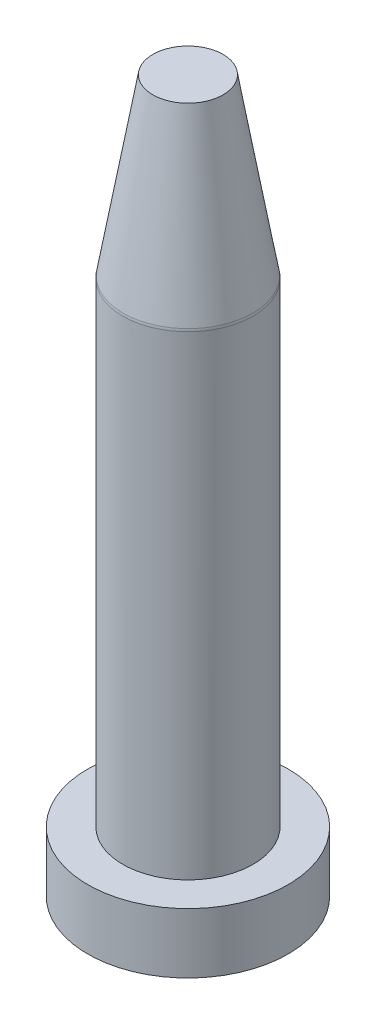
ISO-10303-21;
HEADER;
FILE_DESCRIPTION(('STEP AP214'),'2;1');
FILE_NAME('part.step','',(''),(''),'','','');
FILE_SCHEMA(('AUTOMOTIVE_DESIGN { 1 0 10303 214 1 1 1 1 }'));
ENDSEC;
DATA;
#1=APPLICATION_CONTEXT('core data for automotive mechanical design processes');
#2=APPLICATION_PROTOCOL_DEFINITION('international standard','automotive_design',2000,#1);
#3=PRODUCT_CONTEXT('',#1,'mechanical');
#4=PRODUCT('Part','Part','',(#3));
#5=PRODUCT_RELATED_PRODUCT_CATEGORY('part','',(#4));
#6=PRODUCT_DEFINITION_FORMATION('','',#4);
#7=PRODUCT_DEFINITION_CONTEXT('part definition',#1,'design');
#8=PRODUCT_DEFINITION('design','',#6,#7);
#9=PRODUCT_DEFINITION_SHAPE('','',#8);
#10=(LENGTH_UNIT() NAMED_UNIT(*) SI_UNIT(.MILLI.,.METRE.));
#11=(NAMED_UNIT(*) PLANE_ANGLE_UNIT() SI_UNIT($,.RADIAN.));
#12=(NAMED_UNIT(*) SI_UNIT($,.STERADIAN.) SOLID_ANGLE_UNIT());
#13=UNCERTAINTY_MEASURE_WITH_UNIT(LENGTH_MEASURE(1.E-05),#10,'distance_accuracy_value','');
#14=(GEOMETRIC_REPRESENTATION_CONTEXT(3) GLOBAL_UNCERTAINTY_ASSIGNED_CONTEXT((#13)) GLOBAL_UNIT_ASSIGNED_CONTEXT((#10,
#11,#12)) REPRESENTATION_CONTEXT('',''));
#15=CARTESIAN_POINT('',(0.,0.,0.));
#16=DIRECTION('',(0.,0.,1.));
#17=DIRECTION('',(1.,0.,0.));
#18=AXIS2_PLACEMENT_3D('',#15,#16,#17);
#19=CARTESIAN_POINT('',(0.,142.,0.));
#20=DIRECTION('',(0.,1.,0.));
#21=DIRECTION('',(0.,0.,1.));
#22=AXIS2_PLACEMENT_3D('',#19,#20,#21);
#23=PLANE('',#22);
#24=CARTESIAN_POINT('',(0.,142.,0.));
#25=DIRECTION('',(0.,-1.,0.));
#26=DIRECTION('',(0.,0.,-1.));
#27=AXIS2_PLACEMENT_3D('',#24,#25,#26);
#28=CIRCLE('',#27,7.);
#29=CARTESIAN_POINT('',(0.,142.,-7.));
#30=VERTEX_POINT('',#29);
#31=EDGE_CURVE('E44',#30,#30,#28,.T.);
#32=ORIENTED_EDGE('',*,*,#31,.F.);
#33=EDGE_LOOP('',(#32));
#34=FACE_BOUND('',#33,.T.);
#35=ADVANCED_FACE('F33',(#34),#23,.T.);
#36=CARTESIAN_POINT('',(0.,107.,0.));
#37=DIRECTION('',(0.,-1.,0.));
#38=DIRECTION('',(0.,0.,-1.));
#39=AXIS2_PLACEMENT_3D('',#36,#37,#38);
#40=CONICAL_SURFACE('',#39,13.,0.169778273968338);
#41=CARTESIAN_POINT('',(0.,107.251610540768,0.));
#42=DIRECTION('',(0.,1.,0.));
#43=DIRECTION('',(0.,0.,1.));
#44=AXIS2_PLACEMENT_3D('',#41,#42,#43);
#45=CIRCLE('',#44,12.9568667644398);
#46=CARTESIAN_POINT('',(0.,107.251610540768,12.9568667644398));
#47=VERTEX_POINT('',#46);
#48=EDGE_CURVE('E10',#47,#47,#45,.T.);
#49=ORIENTED_EDGE('',*,*,#48,.T.);
#50=EDGE_LOOP('',(#49));
#51=FACE_BOUND('',#50,.T.);
#52=ORIENTED_EDGE('',*,*,#31,.T.);
#53=EDGE_LOOP('',(#52));
#54=FACE_BOUND('',#53,.T.);
#55=ADVANCED_FACE('F76',(#51,#54),#40,.T.);
#56=CARTESIAN_POINT('',(0.,0.,0.));
#57=DIRECTION('',(0.,-1.,0.));
#58=DIRECTION('',(0.,0.,-1.));
#59=AXIS2_PLACEMENT_3D('',#56,#57,#58);
#60=CYLINDRICAL_SURFACE('',#59,13.);
#61=CARTESIAN_POINT('',(0.,106.744719095435,0.));
#62=DIRECTION('',(0.,1.,0.));
#63=DIRECTION('',(0.,0.,1.));
#64=AXIS2_PLACEMENT_3D('',#61,#62,#63);
#65=CIRCLE('',#64,13.);
#66=CARTESIAN_POINT('',(0.,106.744719095435,13.));
#67=VERTEX_POINT('',#66);
#68=EDGE_CURVE('E40',#67,#67,#65,.F.);
#69=ORIENTED_EDGE('',*,*,#68,.T.);
#70=EDGE_LOOP('',(#69));
#71=FACE_BOUND('',#70,.T.);
#72=CARTESIAN_POINT('',(0.,12.,0.));
#73=DIRECTION('',(0.,-1.,0.));
#74=DIRECTION('',(0.,0.,-1.));
#75=AXIS2_PLACEMENT_3D('',#72,#73,#74);
#76=CIRCLE('',#75,13.);
#77=CARTESIAN_POINT('',(0.,12.,-13.));
#78=VERTEX_POINT('',#77);
#79=EDGE_CURVE('E48',#78,#78,#76,.T.);
#80=ORIENTED_EDGE('',*,*,#79,.F.);
#81=EDGE_LOOP('',(#80));
#82=FACE_BOUND('',#81,.T.);
#83=ADVANCED_FACE('F72',(#71,#82),#60,.T.);
#84=CARTESIAN_POINT('',(20.,12.,0.));
#85=DIRECTION('',(0.,1.,0.));
#86=DIRECTION('',(0.,0.,1.));
#87=AXIS2_PLACEMENT_3D('',#84,#85,#86);
#88=PLANE('',#87);
#89=ORIENTED_EDGE('',*,*,#79,.T.);
#90=EDGE_LOOP('',(#89));
#91=FACE_BOUND('',#90,.T.);
#92=CARTESIAN_POINT('',(0.,12.,0.));
#93=DIRECTION('',(0.,-1.,0.));
#94=DIRECTION('',(0.,0.,-1.));
#95=AXIS2_PLACEMENT_3D('',#92,#93,#94);
#96=CIRCLE('',#95,20.);
#97=CARTESIAN_POINT('',(0.,12.,-20.));
#98=VERTEX_POINT('',#97);
#99=EDGE_CURVE('E53',#98,#98,#96,.T.);
#100=ORIENTED_EDGE('',*,*,#99,.F.);
#101=EDGE_LOOP('',(#100));
#102=FACE_BOUND('',#101,.T.);
#103=ADVANCED_FACE('F64',(#91,#102),#88,.T.);
#104=CARTESIAN_POINT('',(0.,0.,0.));
#105=DIRECTION('',(0.,-1.,0.));
#106=DIRECTION('',(0.,0.,-1.));
#107=AXIS2_PLACEMENT_3D('',#104,#105,#106);
#108=CYLINDRICAL_SURFACE('',#107,20.);
#109=ORIENTED_EDGE('',*,*,#99,.T.);
#110=EDGE_LOOP('',(#109));
#111=FACE_BOUND('',#110,.T.);
#112=CARTESIAN_POINT('',(0.,0.,0.));
#113=DIRECTION('',(0.,-1.,0.));
#114=DIRECTION('',(0.,0.,-1.));
#115=AXIS2_PLACEMENT_3D('',#112,#113,#114);
#116=CIRCLE('',#115,20.);
#117=CARTESIAN_POINT('',(0.,0.,-20.));
#118=VERTEX_POINT('',#117);
#119=EDGE_CURVE('E56',#118,#118,#116,.T.);
#120=ORIENTED_EDGE('',*,*,#119,.F.);
#121=EDGE_LOOP('',(#120));
#122=FACE_BOUND('',#121,.T.);
#123=ADVANCED_FACE('F62',(#111,#122),#108,.T.);
#124=CARTESIAN_POINT('',(0.,0.,0.));
#125=DIRECTION('',(0.,-1.,0.));
#126=DIRECTION('',(0.,0.,-1.));
#127=AXIS2_PLACEMENT_3D('',#124,#125,#126);
#128=PLANE('',#127);
#129=ORIENTED_EDGE('',*,*,#119,.T.);
#130=EDGE_LOOP('',(#129));
#131=FACE_BOUND('',#130,.T.);
#132=ADVANCED_FACE('F60',(#131),#128,.T.);
#133=CARTESIAN_POINT('',(0.,106.744719095435,0.));
#134=DIRECTION('',(0.,1.,0.));
#135=DIRECTION('',(0.,0.,1.));
#136=AXIS2_PLACEMENT_3D('',#133,#134,#135);
#137=TOROIDAL_SURFACE('',#136,10.,3.);
#138=ORIENTED_EDGE('',*,*,#48,.F.);
#139=EDGE_LOOP('',(#138));
#140=FACE_BOUND('',#139,.T.);
#141=ORIENTED_EDGE('',*,*,#68,.F.);
#142=EDGE_LOOP('',(#141));
#143=FACE_BOUND('',#142,.T.);
#144=ADVANCED_FACE('F35',(#140,#143),#137,.T.);
#145=CLOSED_SHELL('',(#35,#55,#83,#103,#123,#132,#144));
#146=MANIFOLD_SOLID_BREP('B2',#145);
#147=ADVANCED_BREP_SHAPE_REPRESENTATION('',(#18,#146),#14);
#148=SHAPE_DEFINITION_REPRESENTATION(#9,#147);
ENDSEC;
END-ISO-10303-21;
